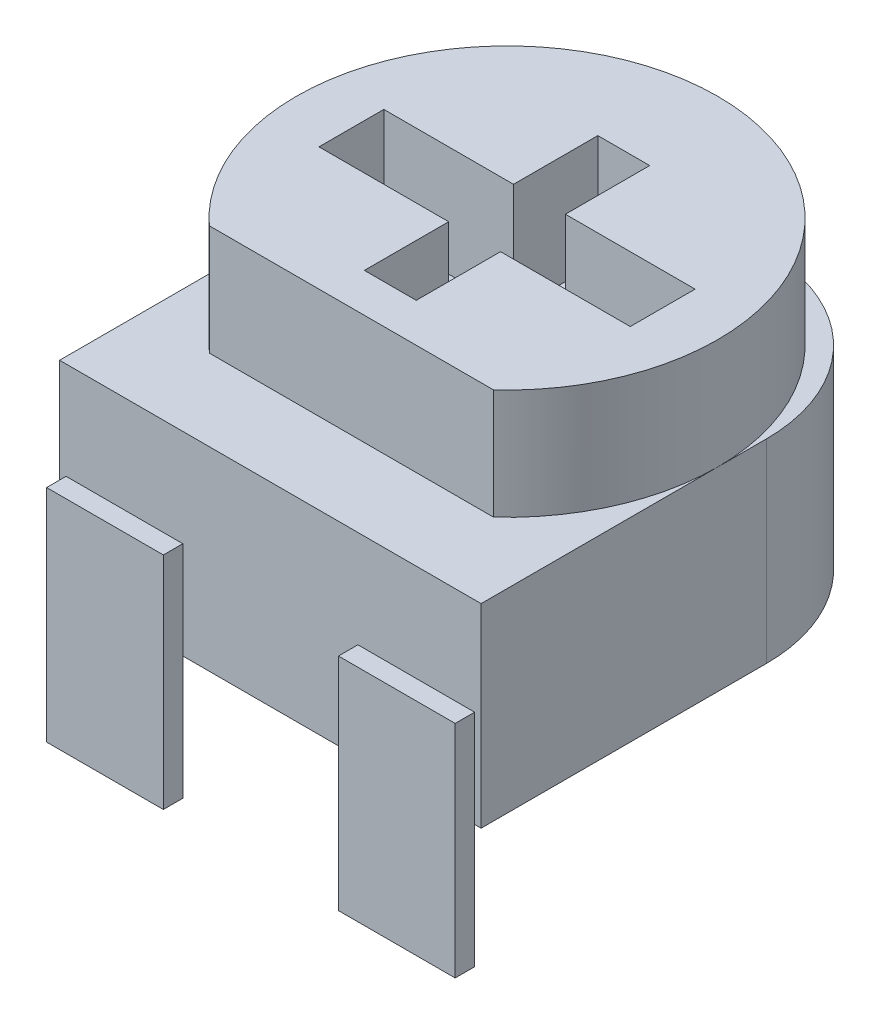
ISO-10303-21;
HEADER;
FILE_DESCRIPTION(('STEP AP214'),'2;1');
FILE_NAME('part.step','',(''),(''),'','','');
FILE_SCHEMA(('AUTOMOTIVE_DESIGN { 1 0 10303 214 1 1 1 1 }'));
ENDSEC;
DATA;
#1=APPLICATION_CONTEXT('core data for automotive mechanical design processes');
#2=APPLICATION_PROTOCOL_DEFINITION('international standard','automotive_design',2000,#1);
#3=PRODUCT_CONTEXT('',#1,'mechanical');
#4=PRODUCT('Part','Part','',(#3));
#5=PRODUCT_RELATED_PRODUCT_CATEGORY('part','',(#4));
#6=PRODUCT_DEFINITION_FORMATION('','',#4);
#7=PRODUCT_DEFINITION_CONTEXT('part definition',#1,'design');
#8=PRODUCT_DEFINITION('design','',#6,#7);
#9=PRODUCT_DEFINITION_SHAPE('','',#8);
#10=(LENGTH_UNIT() NAMED_UNIT(*) SI_UNIT(.MILLI.,.METRE.));
#11=(NAMED_UNIT(*) PLANE_ANGLE_UNIT() SI_UNIT($,.RADIAN.));
#12=(NAMED_UNIT(*) SI_UNIT($,.STERADIAN.) SOLID_ANGLE_UNIT());
#13=UNCERTAINTY_MEASURE_WITH_UNIT(LENGTH_MEASURE(1.E-05),#10,'distance_accuracy_value','');
#14=(GEOMETRIC_REPRESENTATION_CONTEXT(3) GLOBAL_UNCERTAINTY_ASSIGNED_CONTEXT((#13)) GLOBAL_UNIT_ASSIGNED_CONTEXT((#10,
#11,#12)) REPRESENTATION_CONTEXT('',''));
#15=CARTESIAN_POINT('',(0.,0.,0.));
#16=DIRECTION('',(0.,0.,1.));
#17=DIRECTION('',(1.,0.,0.));
#18=AXIS2_PLACEMENT_3D('',#15,#16,#17);
#19=CARTESIAN_POINT('',(0.,0.,0.));
#20=DIRECTION('',(0.,-1.,0.));
#21=DIRECTION('',(0.,0.,-1.));
#22=AXIS2_PLACEMENT_3D('',#19,#20,#21);
#23=PLANE('',#22);
#24=DIRECTION('',(1.,0.,0.));
#25=VECTOR('',#24,1.);
#26=CARTESIAN_POINT('',(-3.25,0.,-3.25));
#27=LINE('',#26,#25);
#28=CARTESIAN_POINT('',(-0.750000000000001,0.,-3.25));
#29=VERTEX_POINT('',#28);
#30=CARTESIAN_POINT('',(0.749999999999998,0.,-3.25));
#31=VERTEX_POINT('',#30);
#32=EDGE_CURVE('E587',#29,#31,#27,.T.);
#33=ORIENTED_EDGE('',*,*,#32,.T.);
#34=CARTESIAN_POINT('',(0.75,0.,-0.75));
#35=DIRECTION('',(0.,-1.,0.));
#36=DIRECTION('',(0.,0.,-1.));
#37=AXIS2_PLACEMENT_3D('',#34,#35,#36);
#38=CIRCLE('',#37,2.5);
#39=CARTESIAN_POINT('',(3.25,0.,-0.750000000000001));
#40=VERTEX_POINT('',#39);
#41=EDGE_CURVE('E638',#31,#40,#38,.T.);
#42=ORIENTED_EDGE('',*,*,#41,.T.);
#43=DIRECTION('',(0.,0.,1.));
#44=VECTOR('',#43,1.);
#45=CARTESIAN_POINT('',(3.25,0.,-3.25));
#46=LINE('',#45,#44);
#47=CARTESIAN_POINT('',(3.25,0.,3.65));
#48=VERTEX_POINT('',#47);
#49=EDGE_CURVE('E608',#40,#48,#46,.T.);
#50=ORIENTED_EDGE('',*,*,#49,.T.);
#51=DIRECTION('',(1.,0.,0.));
#52=VECTOR('',#51,1.);
#53=CARTESIAN_POINT('',(-3.25,0.,3.65));
#54=LINE('',#53,#52);
#55=CARTESIAN_POINT('',(3.15,0.,3.65));
#56=VERTEX_POINT('',#55);
#57=EDGE_CURVE('E612',#56,#48,#54,.T.);
#58=ORIENTED_EDGE('',*,*,#57,.F.);
#59=CARTESIAN_POINT('',(1.35,0.,3.65));
#60=VERTEX_POINT('',#59);
#61=EDGE_CURVE('E679',#60,#56,#54,.T.);
#62=ORIENTED_EDGE('',*,*,#61,.F.);
#63=CARTESIAN_POINT('',(-1.35,0.,3.65));
#64=VERTEX_POINT('',#63);
#65=EDGE_CURVE('E676',#64,#60,#54,.T.);
#66=ORIENTED_EDGE('',*,*,#65,.F.);
#67=CARTESIAN_POINT('',(-3.15,0.,3.65));
#68=VERTEX_POINT('',#67);
#69=EDGE_CURVE('E617',#68,#64,#54,.T.);
#70=ORIENTED_EDGE('',*,*,#69,.F.);
#71=CARTESIAN_POINT('',(-3.25,0.,3.65));
#72=VERTEX_POINT('',#71);
#73=EDGE_CURVE('E613',#72,#68,#54,.T.);
#74=ORIENTED_EDGE('',*,*,#73,.F.);
#75=DIRECTION('',(0.,0.,1.));
#76=VECTOR('',#75,1.);
#77=CARTESIAN_POINT('',(-3.25,0.,-3.25));
#78=LINE('',#77,#76);
#79=CARTESIAN_POINT('',(-3.25,0.,-0.75));
#80=VERTEX_POINT('',#79);
#81=EDGE_CURVE('E616',#80,#72,#78,.T.);
#82=ORIENTED_EDGE('',*,*,#81,.F.);
#83=CARTESIAN_POINT('',(-0.749999999999999,0.,-0.75));
#84=DIRECTION('',(0.,-1.,0.));
#85=DIRECTION('',(0.,0.,-1.));
#86=AXIS2_PLACEMENT_3D('',#83,#84,#85);
#87=CIRCLE('',#86,2.5);
#88=EDGE_CURVE('E635',#80,#29,#87,.T.);
#89=ORIENTED_EDGE('',*,*,#88,.T.);
#90=EDGE_LOOP('',(#33,#42,#50,#58,#62,#66,#70,#74,#82,#89));
#91=FACE_BOUND('',#90,.T.);
#92=DIRECTION('',(1.,0.,0.));
#93=VECTOR('',#92,1.);
#94=CARTESIAN_POINT('',(-1.15,0.,-2.55));
#95=LINE('',#94,#93);
#96=CARTESIAN_POINT('',(-1.15,0.,-2.55));
#97=VERTEX_POINT('',#96);
#98=CARTESIAN_POINT('',(1.15,0.,-2.55));
#99=VERTEX_POINT('',#98);
#100=EDGE_CURVE('E109',#97,#99,#95,.T.);
#101=ORIENTED_EDGE('',*,*,#100,.F.);
#102=DIRECTION('',(0.,0.,-1.));
#103=VECTOR('',#102,1.);
#104=CARTESIAN_POINT('',(-1.15,0.,-2.25));
#105=LINE('',#104,#103);
#106=CARTESIAN_POINT('',(-1.15,0.,-2.25));
#107=VERTEX_POINT('',#106);
#108=EDGE_CURVE('E320',#107,#97,#105,.T.);
#109=ORIENTED_EDGE('',*,*,#108,.F.);
#110=DIRECTION('',(1.,0.,0.));
#111=VECTOR('',#110,1.);
#112=CARTESIAN_POINT('',(-1.15,0.,-2.25));
#113=LINE('',#112,#111);
#114=CARTESIAN_POINT('',(1.15,0.,-2.25));
#115=VERTEX_POINT('',#114);
#116=EDGE_CURVE('E323',#107,#115,#113,.T.);
#117=ORIENTED_EDGE('',*,*,#116,.T.);
#118=DIRECTION('',(0.,0.,-1.));
#119=VECTOR('',#118,1.);
#120=CARTESIAN_POINT('',(1.15,0.,-2.25));
#121=LINE('',#120,#119);
#122=EDGE_CURVE('E114',#115,#99,#121,.T.);
#123=ORIENTED_EDGE('',*,*,#122,.T.);
#124=EDGE_LOOP('',(#101,#109,#117,#123));
#125=FACE_BOUND('',#124,.T.);
#126=ADVANCED_FACE('F93',(#91,#125),#23,.T.);
#127=CARTESIAN_POINT('',(-3.25,3.,3.65));
#128=DIRECTION('',(0.,0.,-1.));
#129=DIRECTION('',(-1.,0.,0.));
#130=AXIS2_PLACEMENT_3D('',#127,#128,#129);
#131=PLANE('',#130);
#132=DIRECTION('',(0.,-1.,0.));
#133=VECTOR('',#132,1.);
#134=CARTESIAN_POINT('',(1.35,1.5,3.65));
#135=LINE('',#134,#133);
#136=CARTESIAN_POINT('',(1.35,1.5,3.65));
#137=VERTEX_POINT('',#136);
#138=EDGE_CURVE('E376',#137,#60,#135,.T.);
#139=ORIENTED_EDGE('',*,*,#138,.F.);
#140=DIRECTION('',(1.,0.,0.));
#141=VECTOR('',#140,1.);
#142=CARTESIAN_POINT('',(1.35,1.5,3.65));
#143=LINE('',#142,#141);
#144=CARTESIAN_POINT('',(3.15,1.5,3.65));
#145=VERTEX_POINT('',#144);
#146=EDGE_CURVE('E390',#137,#145,#143,.T.);
#147=ORIENTED_EDGE('',*,*,#146,.T.);
#148=DIRECTION('',(0.,-1.,0.));
#149=VECTOR('',#148,1.);
#150=CARTESIAN_POINT('',(3.15,1.5,3.65));
#151=LINE('',#150,#149);
#152=EDGE_CURVE('E386',#145,#56,#151,.T.);
#153=ORIENTED_EDGE('',*,*,#152,.T.);
#154=ORIENTED_EDGE('',*,*,#57,.T.);
#155=DIRECTION('',(0.,-1.,0.));
#156=VECTOR('',#155,1.);
#157=CARTESIAN_POINT('',(3.25,3.,3.65));
#158=LINE('',#157,#156);
#159=CARTESIAN_POINT('',(3.25,3.,3.65));
#160=VERTEX_POINT('',#159);
#161=EDGE_CURVE('E604',#160,#48,#158,.T.);
#162=ORIENTED_EDGE('',*,*,#161,.F.);
#163=DIRECTION('',(1.,0.,0.));
#164=VECTOR('',#163,1.);
#165=CARTESIAN_POINT('',(-3.25,3.,3.65));
#166=LINE('',#165,#164);
#167=CARTESIAN_POINT('',(-3.25,3.,3.65));
#168=VERTEX_POINT('',#167);
#169=EDGE_CURVE('E596',#168,#160,#166,.T.);
#170=ORIENTED_EDGE('',*,*,#169,.F.);
#171=DIRECTION('',(0.,-1.,0.));
#172=VECTOR('',#171,1.);
#173=CARTESIAN_POINT('',(-3.25,3.,3.65));
#174=LINE('',#173,#172);
#175=EDGE_CURVE('E620',#168,#72,#174,.T.);
#176=ORIENTED_EDGE('',*,*,#175,.T.);
#177=ORIENTED_EDGE('',*,*,#73,.T.);
#178=DIRECTION('',(0.,-1.,0.));
#179=VECTOR('',#178,1.);
#180=CARTESIAN_POINT('',(-3.15,1.5,3.65));
#181=LINE('',#180,#179);
#182=CARTESIAN_POINT('',(-3.15,1.5,3.65));
#183=VERTEX_POINT('',#182);
#184=EDGE_CURVE('E412',#183,#68,#181,.T.);
#185=ORIENTED_EDGE('',*,*,#184,.F.);
#186=DIRECTION('',(1.,0.,0.));
#187=VECTOR('',#186,1.);
#188=CARTESIAN_POINT('',(-3.15,1.5,3.65));
#189=LINE('',#188,#187);
#190=CARTESIAN_POINT('',(-1.35,1.5,3.65));
#191=VERTEX_POINT('',#190);
#192=EDGE_CURVE('E393',#183,#191,#189,.T.);
#193=ORIENTED_EDGE('',*,*,#192,.T.);
#194=DIRECTION('',(0.,-1.,0.));
#195=VECTOR('',#194,1.);
#196=CARTESIAN_POINT('',(-1.35,1.5,3.65));
#197=LINE('',#196,#195);
#198=EDGE_CURVE('E426',#191,#64,#197,.T.);
#199=ORIENTED_EDGE('',*,*,#198,.T.);
#200=ORIENTED_EDGE('',*,*,#65,.T.);
#201=EDGE_LOOP('',(#139,#147,#153,#154,#162,#170,#176,#177,#185,#193,#199,#200));
#202=FACE_BOUND('',#201,.T.);
#203=ADVANCED_FACE('F665',(#202),#131,.F.);
#204=CARTESIAN_POINT('',(0.,4.7,0.));
#205=DIRECTION('',(0.,-1.,0.));
#206=DIRECTION('',(0.,0.,-1.));
#207=AXIS2_PLACEMENT_3D('',#204,#205,#206);
#208=PLANE('',#207);
#209=DIRECTION('',(1.,0.,0.));
#210=VECTOR('',#209,1.);
#211=CARTESIAN_POINT('',(0.,4.7,1.8));
#212=LINE('',#211,#210);
#213=CARTESIAN_POINT('',(-0.4,4.7,1.8));
#214=VERTEX_POINT('',#213);
#215=CARTESIAN_POINT('',(0.4,4.7,1.8));
#216=VERTEX_POINT('',#215);
#217=EDGE_CURVE('E476',#214,#216,#212,.T.);
#218=ORIENTED_EDGE('',*,*,#217,.F.);
#219=DIRECTION('',(0.,0.,-1.));
#220=VECTOR('',#219,1.);
#221=CARTESIAN_POINT('',(-0.4,4.7,0.));
#222=LINE('',#221,#220);
#223=CARTESIAN_POINT('',(-0.4,4.7,0.5));
#224=VERTEX_POINT('',#223);
#225=EDGE_CURVE('E480',#214,#224,#222,.T.);
#226=ORIENTED_EDGE('',*,*,#225,.T.);
#227=DIRECTION('',(1.,0.,0.));
#228=VECTOR('',#227,1.);
#229=CARTESIAN_POINT('',(0.,4.7,0.5));
#230=LINE('',#229,#228);
#231=CARTESIAN_POINT('',(-2.4,4.7,0.5));
#232=VERTEX_POINT('',#231);
#233=EDGE_CURVE('E536',#232,#224,#230,.T.);
#234=ORIENTED_EDGE('',*,*,#233,.F.);
#235=DIRECTION('',(0.,0.,-1.));
#236=VECTOR('',#235,1.);
#237=CARTESIAN_POINT('',(-2.4,4.7,0.));
#238=LINE('',#237,#236);
#239=CARTESIAN_POINT('',(-2.4,4.7,-0.5));
#240=VERTEX_POINT('',#239);
#241=EDGE_CURVE('E531',#232,#240,#238,.T.);
#242=ORIENTED_EDGE('',*,*,#241,.T.);
#243=DIRECTION('',(1.,0.,0.));
#244=VECTOR('',#243,1.);
#245=CARTESIAN_POINT('',(0.,4.7,-0.5));
#246=LINE('',#245,#244);
#247=CARTESIAN_POINT('',(-0.4,4.7,-0.5));
#248=VERTEX_POINT('',#247);
#249=EDGE_CURVE('E527',#240,#248,#246,.T.);
#250=ORIENTED_EDGE('',*,*,#249,.T.);
#251=CARTESIAN_POINT('',(-0.4,4.7,-1.8));
#252=VERTEX_POINT('',#251);
#253=EDGE_CURVE('E479',#248,#252,#222,.T.);
#254=ORIENTED_EDGE('',*,*,#253,.T.);
#255=DIRECTION('',(1.,0.,0.));
#256=VECTOR('',#255,1.);
#257=CARTESIAN_POINT('',(0.,4.7,-1.8));
#258=LINE('',#257,#256);
#259=CARTESIAN_POINT('',(0.4,4.7,-1.8));
#260=VERTEX_POINT('',#259);
#261=EDGE_CURVE('E467',#252,#260,#258,.T.);
#262=ORIENTED_EDGE('',*,*,#261,.T.);
#263=DIRECTION('',(0.,0.,-1.));
#264=VECTOR('',#263,1.);
#265=CARTESIAN_POINT('',(0.4,4.7,0.));
#266=LINE('',#265,#264);
#267=CARTESIAN_POINT('',(0.4,4.7,-0.5));
#268=VERTEX_POINT('',#267);
#269=EDGE_CURVE('E471',#268,#260,#266,.T.);
#270=ORIENTED_EDGE('',*,*,#269,.F.);
#271=CARTESIAN_POINT('',(2.4,4.7,-0.5));
#272=VERTEX_POINT('',#271);
#273=EDGE_CURVE('E525',#268,#272,#246,.T.);
#274=ORIENTED_EDGE('',*,*,#273,.T.);
#275=DIRECTION('',(0.,0.,-1.));
#276=VECTOR('',#275,1.);
#277=CARTESIAN_POINT('',(2.4,4.7,0.));
#278=LINE('',#277,#276);
#279=CARTESIAN_POINT('',(2.4,4.7,0.5));
#280=VERTEX_POINT('',#279);
#281=EDGE_CURVE('E521',#280,#272,#278,.T.);
#282=ORIENTED_EDGE('',*,*,#281,.F.);
#283=CARTESIAN_POINT('',(0.4,4.7,0.5));
#284=VERTEX_POINT('',#283);
#285=EDGE_CURVE('E535',#284,#280,#230,.T.);
#286=ORIENTED_EDGE('',*,*,#285,.F.);
#287=EDGE_CURVE('E473',#216,#284,#266,.T.);
#288=ORIENTED_EDGE('',*,*,#287,.F.);
#289=EDGE_LOOP('',(#218,#226,#234,#242,#250,#254,#262,#270,#274,#282,#286,#288));
#290=FACE_BOUND('',#289,.T.);
#291=DIRECTION('',(1.,0.,0.));
#292=VECTOR('',#291,1.);
#293=CARTESIAN_POINT('',(0.,4.7,2.4));
#294=LINE('',#293,#292);
#295=CARTESIAN_POINT('',(-2.19146070008111,4.7,2.4));
#296=VERTEX_POINT('',#295);
#297=CARTESIAN_POINT('',(2.19146070008111,4.7,2.4));
#298=VERTEX_POINT('',#297);
#299=EDGE_CURVE('E453',#296,#298,#294,.T.);
#300=ORIENTED_EDGE('',*,*,#299,.T.);
#301=CARTESIAN_POINT('',(0.,4.7,0.));
#302=DIRECTION('',(0.,-1.,0.));
#303=DIRECTION('',(0.,0.,-1.));
#304=AXIS2_PLACEMENT_3D('',#301,#302,#303);
#305=CIRCLE('',#304,3.25);
#306=EDGE_CURVE('E571',#296,#298,#305,.T.);
#307=ORIENTED_EDGE('',*,*,#306,.F.);
#308=EDGE_LOOP('',(#300,#307));
#309=FACE_BOUND('',#308,.T.);
#310=ADVANCED_FACE('F727',(#290,#309),#208,.F.);
#311=CARTESIAN_POINT('',(0.,4.7,0.));
#312=DIRECTION('',(0.,-1.,0.));
#313=DIRECTION('',(0.,0.,-1.));
#314=AXIS2_PLACEMENT_3D('',#311,#312,#313);
#315=CYLINDRICAL_SURFACE('',#314,3.25);
#316=CARTESIAN_POINT('',(0.,3.,0.));
#317=DIRECTION('',(0.,-1.,0.));
#318=DIRECTION('',(0.,0.,-1.));
#319=AXIS2_PLACEMENT_3D('',#316,#317,#318);
#320=CIRCLE('',#319,3.25);
#321=CARTESIAN_POINT('',(-2.19146070008111,3.,2.4));
#322=VERTEX_POINT('',#321);
#323=CARTESIAN_POINT('',(-3.25,3.,0.));
#324=VERTEX_POINT('',#323);
#325=EDGE_CURVE('E579',#322,#324,#320,.T.);
#326=ORIENTED_EDGE('',*,*,#325,.F.);
#327=DIRECTION('',(0.,1.,0.));
#328=VECTOR('',#327,1.);
#329=CARTESIAN_POINT('',(-2.19146070008111,-1.4645828472546,2.4));
#330=LINE('',#329,#328);
#331=EDGE_CURVE('E458',#322,#296,#330,.T.);
#332=ORIENTED_EDGE('',*,*,#331,.T.);
#333=ORIENTED_EDGE('',*,*,#306,.T.);
#334=DIRECTION('',(0.,1.,0.));
#335=VECTOR('',#334,1.);
#336=CARTESIAN_POINT('',(2.19146070008111,-1.4645828472546,2.4));
#337=LINE('',#336,#335);
#338=CARTESIAN_POINT('',(2.19146070008111,3.,2.4));
#339=VERTEX_POINT('',#338);
#340=EDGE_CURVE('E441',#339,#298,#337,.T.);
#341=ORIENTED_EDGE('',*,*,#340,.F.);
#342=CARTESIAN_POINT('',(3.25,3.,0.));
#343=VERTEX_POINT('',#342);
#344=EDGE_CURVE('E631',#343,#339,#320,.T.);
#345=ORIENTED_EDGE('',*,*,#344,.F.);
#346=CARTESIAN_POINT('',(0.,3.,-3.25));
#347=VERTEX_POINT('',#346);
#348=EDGE_CURVE('E570',#347,#343,#320,.T.);
#349=ORIENTED_EDGE('',*,*,#348,.F.);
#350=EDGE_CURVE('E580',#324,#347,#320,.T.);
#351=ORIENTED_EDGE('',*,*,#350,.F.);
#352=EDGE_LOOP('',(#326,#332,#333,#341,#345,#349,#351));
#353=FACE_BOUND('',#352,.T.);
#354=ADVANCED_FACE('F771',(#353),#315,.T.);
#355=CARTESIAN_POINT('',(0.,3.,0.));
#356=DIRECTION('',(0.,-1.,0.));
#357=DIRECTION('',(0.,0.,-1.));
#358=AXIS2_PLACEMENT_3D('',#355,#356,#357);
#359=PLANE('',#358);
#360=DIRECTION('',(0.,0.,1.));
#361=VECTOR('',#360,1.);
#362=CARTESIAN_POINT('',(3.25,3.,-3.25));
#363=LINE('',#362,#361);
#364=CARTESIAN_POINT('',(3.25,3.,-0.750000000000001));
#365=VERTEX_POINT('',#364);
#366=EDGE_CURVE('E593',#365,#343,#363,.T.);
#367=ORIENTED_EDGE('',*,*,#366,.F.);
#368=CARTESIAN_POINT('',(0.75,3.,-0.75));
#369=DIRECTION('',(0.,-1.,0.));
#370=DIRECTION('',(0.,0.,-1.));
#371=AXIS2_PLACEMENT_3D('',#368,#369,#370);
#372=CIRCLE('',#371,2.5);
#373=CARTESIAN_POINT('',(0.749999999999998,3.,-3.25));
#374=VERTEX_POINT('',#373);
#375=EDGE_CURVE('E644',#365,#374,#372,.F.);
#376=ORIENTED_EDGE('',*,*,#375,.T.);
#377=DIRECTION('',(1.,0.,0.));
#378=VECTOR('',#377,1.);
#379=CARTESIAN_POINT('',(-3.25,3.,-3.25));
#380=LINE('',#379,#378);
#381=EDGE_CURVE('E592',#347,#374,#380,.T.);
#382=ORIENTED_EDGE('',*,*,#381,.F.);
#383=ORIENTED_EDGE('',*,*,#348,.T.);
#384=EDGE_LOOP('',(#367,#376,#382,#383));
#385=FACE_BOUND('',#384,.T.);
#386=ADVANCED_FACE('F761',(#385),#359,.F.);
#387=EDGE_CURVE('E591',#343,#160,#363,.T.);
#388=ORIENTED_EDGE('',*,*,#387,.F.);
#389=ORIENTED_EDGE('',*,*,#344,.T.);
#390=DIRECTION('',(1.,0.,0.));
#391=VECTOR('',#390,1.);
#392=CARTESIAN_POINT('',(0.,3.,2.4));
#393=LINE('',#392,#391);
#394=EDGE_CURVE('E457',#322,#339,#393,.T.);
#395=ORIENTED_EDGE('',*,*,#394,.F.);
#396=ORIENTED_EDGE('',*,*,#325,.T.);
#397=DIRECTION('',(0.,0.,1.));
#398=VECTOR('',#397,1.);
#399=CARTESIAN_POINT('',(-3.25,3.,-3.25));
#400=LINE('',#399,#398);
#401=EDGE_CURVE('E600',#324,#168,#400,.T.);
#402=ORIENTED_EDGE('',*,*,#401,.T.);
#403=ORIENTED_EDGE('',*,*,#169,.T.);
#404=EDGE_LOOP('',(#388,#389,#395,#396,#402,#403));
#405=FACE_BOUND('',#404,.T.);
#406=ADVANCED_FACE('F741',(#405),#359,.F.);
#407=CARTESIAN_POINT('',(-3.25,3.,-3.25));
#408=DIRECTION('',(0.,0.,-1.));
#409=DIRECTION('',(-1.,0.,0.));
#410=AXIS2_PLACEMENT_3D('',#407,#408,#409);
#411=PLANE('',#410);
#412=ORIENTED_EDGE('',*,*,#381,.T.);
#413=DIRECTION('',(0.,-1.,0.));
#414=VECTOR('',#413,1.);
#415=CARTESIAN_POINT('',(0.749999999999999,3.,-3.25));
#416=LINE('',#415,#414);
#417=EDGE_CURVE('E630',#374,#31,#416,.T.);
#418=ORIENTED_EDGE('',*,*,#417,.T.);
#419=ORIENTED_EDGE('',*,*,#32,.F.);
#420=DIRECTION('',(0.,-1.,0.));
#421=VECTOR('',#420,1.);
#422=CARTESIAN_POINT('',(-0.75,3.,-3.25));
#423=LINE('',#422,#421);
#424=CARTESIAN_POINT('',(-0.750000000000001,3.,-3.25));
#425=VERTEX_POINT('',#424);
#426=EDGE_CURVE('E627',#29,#425,#423,.F.);
#427=ORIENTED_EDGE('',*,*,#426,.T.);
#428=EDGE_CURVE('E588',#425,#347,#380,.T.);
#429=ORIENTED_EDGE('',*,*,#428,.T.);
#430=EDGE_LOOP('',(#412,#418,#419,#427,#429));
#431=FACE_BOUND('',#430,.T.);
#432=ADVANCED_FACE('F735',(#431),#411,.T.);
#433=CARTESIAN_POINT('',(-3.25,3.,-3.25));
#434=DIRECTION('',(1.,0.,0.));
#435=DIRECTION('',(0.,0.,-1.));
#436=AXIS2_PLACEMENT_3D('',#433,#434,#435);
#437=PLANE('',#436);
#438=CARTESIAN_POINT('',(-3.25,3.,-0.75));
#439=VERTEX_POINT('',#438);
#440=EDGE_CURVE('E601',#439,#324,#400,.T.);
#441=ORIENTED_EDGE('',*,*,#440,.F.);
#442=DIRECTION('',(0.,-1.,0.));
#443=VECTOR('',#442,1.);
#444=CARTESIAN_POINT('',(-3.25,0.,-0.75));
#445=LINE('',#444,#443);
#446=EDGE_CURVE('E102',#439,#80,#445,.T.);
#447=ORIENTED_EDGE('',*,*,#446,.T.);
#448=ORIENTED_EDGE('',*,*,#81,.T.);
#449=ORIENTED_EDGE('',*,*,#175,.F.);
#450=ORIENTED_EDGE('',*,*,#401,.F.);
#451=EDGE_LOOP('',(#441,#447,#448,#449,#450));
#452=FACE_BOUND('',#451,.T.);
#453=ADVANCED_FACE('F652',(#452),#437,.F.);
#454=CARTESIAN_POINT('',(3.25,3.,-3.25));
#455=DIRECTION('',(1.,0.,0.));
#456=DIRECTION('',(0.,0.,-1.));
#457=AXIS2_PLACEMENT_3D('',#454,#455,#456);
#458=PLANE('',#457);
#459=ORIENTED_EDGE('',*,*,#49,.F.);
#460=DIRECTION('',(0.,-1.,0.));
#461=VECTOR('',#460,1.);
#462=CARTESIAN_POINT('',(3.25,3.,-0.750000000000001));
#463=LINE('',#462,#461);
#464=EDGE_CURVE('E641',#40,#365,#463,.F.);
#465=ORIENTED_EDGE('',*,*,#464,.T.);
#466=ORIENTED_EDGE('',*,*,#366,.T.);
#467=ORIENTED_EDGE('',*,*,#387,.T.);
#468=ORIENTED_EDGE('',*,*,#161,.T.);
#469=EDGE_LOOP('',(#459,#465,#466,#467,#468));
#470=FACE_BOUND('',#469,.T.);
#471=ADVANCED_FACE('F734',(#470),#458,.T.);
#472=ORIENTED_EDGE('',*,*,#428,.F.);
#473=CARTESIAN_POINT('',(-0.749999999999999,3.,-0.75));
#474=DIRECTION('',(0.,-1.,0.));
#475=DIRECTION('',(0.,0.,-1.));
#476=AXIS2_PLACEMENT_3D('',#473,#474,#475);
#477=CIRCLE('',#476,2.5);
#478=EDGE_CURVE('E12',#425,#439,#477,.F.);
#479=ORIENTED_EDGE('',*,*,#478,.T.);
#480=ORIENTED_EDGE('',*,*,#440,.T.);
#481=ORIENTED_EDGE('',*,*,#350,.T.);
#482=EDGE_LOOP('',(#472,#479,#480,#481));
#483=FACE_BOUND('',#482,.T.);
#484=ADVANCED_FACE('F731',(#483),#359,.F.);
#485=CARTESIAN_POINT('',(0.,4.7,-0.5));
#486=DIRECTION('',(0.,0.,-1.));
#487=DIRECTION('',(-1.,0.,0.));
#488=AXIS2_PLACEMENT_3D('',#485,#486,#487);
#489=PLANE('',#488);
#490=DIRECTION('',(0.,1.,0.));
#491=VECTOR('',#490,1.);
#492=CARTESIAN_POINT('',(0.4,4.7,-0.5));
#493=LINE('',#492,#491);
#494=CARTESIAN_POINT('',(0.4,3.,-0.5));
#495=VERTEX_POINT('',#494);
#496=EDGE_CURVE('E505',#495,#268,#493,.T.);
#497=ORIENTED_EDGE('',*,*,#496,.F.);
#498=DIRECTION('',(1.,0.,0.));
#499=VECTOR('',#498,1.);
#500=CARTESIAN_POINT('',(0.,3.,-0.5));
#501=LINE('',#500,#499);
#502=CARTESIAN_POINT('',(2.4,3.,-0.5));
#503=VERTEX_POINT('',#502);
#504=EDGE_CURVE('E544',#495,#503,#501,.T.);
#505=ORIENTED_EDGE('',*,*,#504,.T.);
#506=DIRECTION('',(0.,-1.,0.));
#507=VECTOR('',#506,1.);
#508=CARTESIAN_POINT('',(2.4,4.7,-0.5));
#509=LINE('',#508,#507);
#510=EDGE_CURVE('E566',#272,#503,#509,.T.);
#511=ORIENTED_EDGE('',*,*,#510,.F.);
#512=ORIENTED_EDGE('',*,*,#273,.F.);
#513=EDGE_LOOP('',(#497,#505,#511,#512));
#514=FACE_BOUND('',#513,.T.);
#515=ADVANCED_FACE('F871',(#514),#489,.F.);
#516=CARTESIAN_POINT('',(0.,4.7,0.5));
#517=DIRECTION('',(0.,0.,-1.));
#518=DIRECTION('',(-1.,0.,0.));
#519=AXIS2_PLACEMENT_3D('',#516,#517,#518);
#520=PLANE('',#519);
#521=DIRECTION('',(1.,0.,0.));
#522=VECTOR('',#521,1.);
#523=CARTESIAN_POINT('',(0.,3.,0.5));
#524=LINE('',#523,#522);
#525=CARTESIAN_POINT('',(0.4,3.,0.5));
#526=VERTEX_POINT('',#525);
#527=CARTESIAN_POINT('',(2.4,3.,0.5));
#528=VERTEX_POINT('',#527);
#529=EDGE_CURVE('E553',#526,#528,#524,.T.);
#530=ORIENTED_EDGE('',*,*,#529,.F.);
#531=DIRECTION('',(0.,1.,0.));
#532=VECTOR('',#531,1.);
#533=CARTESIAN_POINT('',(0.4,4.7,0.5));
#534=LINE('',#533,#532);
#535=EDGE_CURVE('E575',#526,#284,#534,.T.);
#536=ORIENTED_EDGE('',*,*,#535,.T.);
#537=ORIENTED_EDGE('',*,*,#285,.T.);
#538=DIRECTION('',(0.,-1.,0.));
#539=VECTOR('',#538,1.);
#540=CARTESIAN_POINT('',(2.4,4.7,0.5));
#541=LINE('',#540,#539);
#542=EDGE_CURVE('E540',#280,#528,#541,.T.);
#543=ORIENTED_EDGE('',*,*,#542,.T.);
#544=EDGE_LOOP('',(#530,#536,#537,#543));
#545=FACE_BOUND('',#544,.T.);
#546=ADVANCED_FACE('F862',(#545),#520,.T.);
#547=CARTESIAN_POINT('',(2.4,4.7,0.));
#548=DIRECTION('',(-1.,0.,0.));
#549=DIRECTION('',(0.,0.,1.));
#550=AXIS2_PLACEMENT_3D('',#547,#548,#549);
#551=PLANE('',#550);
#552=DIRECTION('',(0.,0.,-1.));
#553=VECTOR('',#552,1.);
#554=CARTESIAN_POINT('',(2.4,3.,0.));
#555=LINE('',#554,#553);
#556=EDGE_CURVE('E520',#528,#503,#555,.T.);
#557=ORIENTED_EDGE('',*,*,#556,.F.);
#558=ORIENTED_EDGE('',*,*,#542,.F.);
#559=ORIENTED_EDGE('',*,*,#281,.T.);
#560=ORIENTED_EDGE('',*,*,#510,.T.);
#561=EDGE_LOOP('',(#557,#558,#559,#560));
#562=FACE_BOUND('',#561,.T.);
#563=ADVANCED_FACE('F869',(#562),#551,.T.);
#564=CARTESIAN_POINT('',(-2.4,3.,-0.5));
#565=VERTEX_POINT('',#564);
#566=CARTESIAN_POINT('',(-0.4,3.,-0.5));
#567=VERTEX_POINT('',#566);
#568=EDGE_CURVE('E545',#565,#567,#501,.T.);
#569=ORIENTED_EDGE('',*,*,#568,.T.);
#570=DIRECTION('',(0.,1.,0.));
#571=VECTOR('',#570,1.);
#572=CARTESIAN_POINT('',(-0.4,4.7,-0.5));
#573=LINE('',#572,#571);
#574=EDGE_CURVE('E516',#567,#248,#573,.T.);
#575=ORIENTED_EDGE('',*,*,#574,.T.);
#576=ORIENTED_EDGE('',*,*,#249,.F.);
#577=DIRECTION('',(0.,-1.,0.));
#578=VECTOR('',#577,1.);
#579=CARTESIAN_POINT('',(-2.4,4.7,-0.5));
#580=LINE('',#579,#578);
#581=EDGE_CURVE('E563',#240,#565,#580,.T.);
#582=ORIENTED_EDGE('',*,*,#581,.T.);
#583=EDGE_LOOP('',(#569,#575,#576,#582));
#584=FACE_BOUND('',#583,.T.);
#585=ADVANCED_FACE('F865',(#584),#489,.F.);
#586=CARTESIAN_POINT('',(-2.4,4.7,0.));
#587=DIRECTION('',(-1.,0.,0.));
#588=DIRECTION('',(0.,0.,1.));
#589=AXIS2_PLACEMENT_3D('',#586,#587,#588);
#590=PLANE('',#589);
#591=DIRECTION('',(0.,0.,-1.));
#592=VECTOR('',#591,1.);
#593=CARTESIAN_POINT('',(-2.4,3.,0.));
#594=LINE('',#593,#592);
#595=CARTESIAN_POINT('',(-2.4,3.,0.5));
#596=VERTEX_POINT('',#595);
#597=EDGE_CURVE('E549',#596,#565,#594,.T.);
#598=ORIENTED_EDGE('',*,*,#597,.T.);
#599=ORIENTED_EDGE('',*,*,#581,.F.);
#600=ORIENTED_EDGE('',*,*,#241,.F.);
#601=DIRECTION('',(0.,-1.,0.));
#602=VECTOR('',#601,1.);
#603=CARTESIAN_POINT('',(-2.4,4.7,0.5));
#604=LINE('',#603,#602);
#605=EDGE_CURVE('E560',#232,#596,#604,.T.);
#606=ORIENTED_EDGE('',*,*,#605,.T.);
#607=EDGE_LOOP('',(#598,#599,#600,#606));
#608=FACE_BOUND('',#607,.T.);
#609=ADVANCED_FACE('F860',(#608),#590,.F.);
#610=DIRECTION('',(0.,1.,0.));
#611=VECTOR('',#610,1.);
#612=CARTESIAN_POINT('',(-0.4,4.7,0.5));
#613=LINE('',#612,#611);
#614=CARTESIAN_POINT('',(-0.4,3.,0.5));
#615=VERTEX_POINT('',#614);
#616=EDGE_CURVE('E584',#615,#224,#613,.T.);
#617=ORIENTED_EDGE('',*,*,#616,.F.);
#618=EDGE_CURVE('E526',#596,#615,#524,.T.);
#619=ORIENTED_EDGE('',*,*,#618,.F.);
#620=ORIENTED_EDGE('',*,*,#605,.F.);
#621=ORIENTED_EDGE('',*,*,#233,.T.);
#622=EDGE_LOOP('',(#617,#619,#620,#621));
#623=FACE_BOUND('',#622,.T.);
#624=ADVANCED_FACE('F843',(#623),#520,.T.);
#625=CARTESIAN_POINT('',(-0.4,4.7,0.));
#626=DIRECTION('',(-1.,0.,0.));
#627=DIRECTION('',(0.,0.,1.));
#628=AXIS2_PLACEMENT_3D('',#625,#626,#627);
#629=PLANE('',#628);
#630=ORIENTED_EDGE('',*,*,#616,.T.);
#631=ORIENTED_EDGE('',*,*,#225,.F.);
#632=DIRECTION('',(0.,-1.,0.));
#633=VECTOR('',#632,1.);
#634=CARTESIAN_POINT('',(-0.4,4.7,1.8));
#635=LINE('',#634,#633);
#636=CARTESIAN_POINT('',(-0.4,3.,1.8));
#637=VERTEX_POINT('',#636);
#638=EDGE_CURVE('E506',#214,#637,#635,.T.);
#639=ORIENTED_EDGE('',*,*,#638,.T.);
#640=DIRECTION('',(0.,0.,-1.));
#641=VECTOR('',#640,1.);
#642=CARTESIAN_POINT('',(-0.4,3.,0.));
#643=LINE('',#642,#641);
#644=EDGE_CURVE('E472',#637,#615,#643,.T.);
#645=ORIENTED_EDGE('',*,*,#644,.T.);
#646=EDGE_LOOP('',(#630,#631,#639,#645));
#647=FACE_BOUND('',#646,.T.);
#648=ADVANCED_FACE('F839',(#647),#629,.F.);
#649=CARTESIAN_POINT('',(0.4,4.7,0.));
#650=DIRECTION('',(-1.,0.,0.));
#651=DIRECTION('',(0.,0.,1.));
#652=AXIS2_PLACEMENT_3D('',#649,#650,#651);
#653=PLANE('',#652);
#654=DIRECTION('',(0.,0.,-1.));
#655=VECTOR('',#654,1.);
#656=CARTESIAN_POINT('',(0.4,3.,0.));
#657=LINE('',#656,#655);
#658=CARTESIAN_POINT('',(0.4,3.,1.8));
#659=VERTEX_POINT('',#658);
#660=EDGE_CURVE('E489',#659,#526,#657,.T.);
#661=ORIENTED_EDGE('',*,*,#660,.F.);
#662=DIRECTION('',(0.,-1.,0.));
#663=VECTOR('',#662,1.);
#664=CARTESIAN_POINT('',(0.4,4.7,1.8));
#665=LINE('',#664,#663);
#666=EDGE_CURVE('E509',#216,#659,#665,.T.);
#667=ORIENTED_EDGE('',*,*,#666,.F.);
#668=ORIENTED_EDGE('',*,*,#287,.T.);
#669=ORIENTED_EDGE('',*,*,#535,.F.);
#670=EDGE_LOOP('',(#661,#667,#668,#669));
#671=FACE_BOUND('',#670,.T.);
#672=ADVANCED_FACE('F842',(#671),#653,.T.);
#673=CARTESIAN_POINT('',(0.,4.7,1.8));
#674=DIRECTION('',(0.,0.,-1.));
#675=DIRECTION('',(-1.,0.,0.));
#676=AXIS2_PLACEMENT_3D('',#673,#674,#675);
#677=PLANE('',#676);
#678=DIRECTION('',(1.,0.,0.));
#679=VECTOR('',#678,1.);
#680=CARTESIAN_POINT('',(0.,3.,1.8));
#681=LINE('',#680,#679);
#682=EDGE_CURVE('E493',#637,#659,#681,.T.);
#683=ORIENTED_EDGE('',*,*,#682,.F.);
#684=ORIENTED_EDGE('',*,*,#638,.F.);
#685=ORIENTED_EDGE('',*,*,#217,.T.);
#686=ORIENTED_EDGE('',*,*,#666,.T.);
#687=EDGE_LOOP('',(#683,#684,#685,#686));
#688=FACE_BOUND('',#687,.T.);
#689=ADVANCED_FACE('F846',(#688),#677,.T.);
#690=CARTESIAN_POINT('',(-0.4,3.,-1.8));
#691=VERTEX_POINT('',#690);
#692=EDGE_CURVE('E497',#567,#691,#643,.T.);
#693=ORIENTED_EDGE('',*,*,#692,.T.);
#694=DIRECTION('',(0.,-1.,0.));
#695=VECTOR('',#694,1.);
#696=CARTESIAN_POINT('',(-0.4,4.7,-1.8));
#697=LINE('',#696,#695);
#698=EDGE_CURVE('E501',#252,#691,#697,.T.);
#699=ORIENTED_EDGE('',*,*,#698,.F.);
#700=ORIENTED_EDGE('',*,*,#253,.F.);
#701=ORIENTED_EDGE('',*,*,#574,.F.);
#702=EDGE_LOOP('',(#693,#699,#700,#701));
#703=FACE_BOUND('',#702,.T.);
#704=ADVANCED_FACE('F845',(#703),#629,.F.);
#705=ORIENTED_EDGE('',*,*,#496,.T.);
#706=ORIENTED_EDGE('',*,*,#269,.T.);
#707=DIRECTION('',(0.,-1.,0.));
#708=VECTOR('',#707,1.);
#709=CARTESIAN_POINT('',(0.4,4.7,-1.8));
#710=LINE('',#709,#708);
#711=CARTESIAN_POINT('',(0.4,3.,-1.8));
#712=VERTEX_POINT('',#711);
#713=EDGE_CURVE('E484',#260,#712,#710,.T.);
#714=ORIENTED_EDGE('',*,*,#713,.T.);
#715=EDGE_CURVE('E488',#495,#712,#657,.T.);
#716=ORIENTED_EDGE('',*,*,#715,.F.);
#717=EDGE_LOOP('',(#705,#706,#714,#716));
#718=FACE_BOUND('',#717,.T.);
#719=ADVANCED_FACE('F853',(#718),#653,.T.);
#720=CARTESIAN_POINT('',(0.,4.7,-1.8));
#721=DIRECTION('',(0.,0.,-1.));
#722=DIRECTION('',(-1.,0.,0.));
#723=AXIS2_PLACEMENT_3D('',#720,#721,#722);
#724=PLANE('',#723);
#725=DIRECTION('',(1.,0.,0.));
#726=VECTOR('',#725,1.);
#727=CARTESIAN_POINT('',(0.,3.,-1.8));
#728=LINE('',#727,#726);
#729=EDGE_CURVE('E461',#691,#712,#728,.T.);
#730=ORIENTED_EDGE('',*,*,#729,.T.);
#731=ORIENTED_EDGE('',*,*,#713,.F.);
#732=ORIENTED_EDGE('',*,*,#261,.F.);
#733=ORIENTED_EDGE('',*,*,#698,.T.);
#734=EDGE_LOOP('',(#730,#731,#732,#733));
#735=FACE_BOUND('',#734,.T.);
#736=ADVANCED_FACE('F854',(#735),#724,.F.);
#737=ORIENTED_EDGE('',*,*,#644,.F.);
#738=ORIENTED_EDGE('',*,*,#682,.T.);
#739=ORIENTED_EDGE('',*,*,#660,.T.);
#740=ORIENTED_EDGE('',*,*,#529,.T.);
#741=ORIENTED_EDGE('',*,*,#556,.T.);
#742=ORIENTED_EDGE('',*,*,#504,.F.);
#743=ORIENTED_EDGE('',*,*,#715,.T.);
#744=ORIENTED_EDGE('',*,*,#729,.F.);
#745=ORIENTED_EDGE('',*,*,#692,.F.);
#746=ORIENTED_EDGE('',*,*,#568,.F.);
#747=ORIENTED_EDGE('',*,*,#597,.F.);
#748=ORIENTED_EDGE('',*,*,#618,.T.);
#749=EDGE_LOOP('',(#737,#738,#739,#740,#741,#742,#743,#744,#745,#746,#747,#748));
#750=FACE_BOUND('',#749,.T.);
#751=ADVANCED_FACE('F752',(#750),#359,.F.);
#752=CARTESIAN_POINT('',(0.,-1.4645828472546,2.4));
#753=DIRECTION('',(0.,0.,1.));
#754=DIRECTION('',(1.,0.,0.));
#755=AXIS2_PLACEMENT_3D('',#752,#753,#754);
#756=PLANE('',#755);
#757=ORIENTED_EDGE('',*,*,#394,.T.);
#758=ORIENTED_EDGE('',*,*,#340,.T.);
#759=ORIENTED_EDGE('',*,*,#299,.F.);
#760=ORIENTED_EDGE('',*,*,#331,.F.);
#761=EDGE_LOOP('',(#757,#758,#759,#760));
#762=FACE_BOUND('',#761,.T.);
#763=ADVANCED_FACE('F745',(#762),#756,.T.);
#764=CARTESIAN_POINT('',(0.75,3.,-0.75));
#765=DIRECTION('',(0.,-1.,0.));
#766=DIRECTION('',(0.,0.,-1.));
#767=AXIS2_PLACEMENT_3D('',#764,#765,#766);
#768=CYLINDRICAL_SURFACE('',#767,2.5);
#769=ORIENTED_EDGE('',*,*,#375,.F.);
#770=ORIENTED_EDGE('',*,*,#464,.F.);
#771=ORIENTED_EDGE('',*,*,#41,.F.);
#772=ORIENTED_EDGE('',*,*,#417,.F.);
#773=EDGE_LOOP('',(#769,#770,#771,#772));
#774=FACE_BOUND('',#773,.T.);
#775=ADVANCED_FACE('F743',(#774),#768,.T.);
#776=CARTESIAN_POINT('',(-0.749999999999999,3.,-0.75));
#777=DIRECTION('',(0.,1.,0.));
#778=DIRECTION('',(0.,0.,1.));
#779=AXIS2_PLACEMENT_3D('',#776,#777,#778);
#780=CYLINDRICAL_SURFACE('',#779,2.5);
#781=ORIENTED_EDGE('',*,*,#478,.F.);
#782=ORIENTED_EDGE('',*,*,#426,.F.);
#783=ORIENTED_EDGE('',*,*,#88,.F.);
#784=ORIENTED_EDGE('',*,*,#446,.F.);
#785=EDGE_LOOP('',(#781,#782,#783,#784));
#786=FACE_BOUND('',#785,.T.);
#787=ADVANCED_FACE('F95',(#786),#780,.T.);
#788=CARTESIAN_POINT('',(-3.15,1.5,3.95));
#789=DIRECTION('',(0.,1.,0.));
#790=DIRECTION('',(0.,0.,1.));
#791=AXIS2_PLACEMENT_3D('',#788,#789,#790);
#792=PLANE('',#791);
#793=ORIENTED_EDGE('',*,*,#192,.F.);
#794=DIRECTION('',(0.,0.,-1.));
#795=VECTOR('',#794,1.);
#796=CARTESIAN_POINT('',(-3.15,1.5,3.95));
#797=LINE('',#796,#795);
#798=CARTESIAN_POINT('',(-3.15,1.5,3.95));
#799=VERTEX_POINT('',#798);
#800=EDGE_CURVE('E437',#799,#183,#797,.T.);
#801=ORIENTED_EDGE('',*,*,#800,.F.);
#802=DIRECTION('',(1.,0.,0.));
#803=VECTOR('',#802,1.);
#804=CARTESIAN_POINT('',(-3.15,1.5,3.95));
#805=LINE('',#804,#803);
#806=CARTESIAN_POINT('',(-1.35,1.5,3.95));
#807=VERTEX_POINT('',#806);
#808=EDGE_CURVE('E407',#799,#807,#805,.T.);
#809=ORIENTED_EDGE('',*,*,#808,.T.);
#810=DIRECTION('',(0.,0.,-1.));
#811=VECTOR('',#810,1.);
#812=CARTESIAN_POINT('',(-1.35,1.5,3.95));
#813=LINE('',#812,#811);
#814=EDGE_CURVE('E422',#807,#191,#813,.T.);
#815=ORIENTED_EDGE('',*,*,#814,.T.);
#816=EDGE_LOOP('',(#793,#801,#809,#815));
#817=FACE_BOUND('',#816,.T.);
#818=ADVANCED_FACE('F751',(#817),#792,.T.);
#819=CARTESIAN_POINT('',(-3.15,1.5,3.95));
#820=DIRECTION('',(1.,0.,0.));
#821=DIRECTION('',(0.,0.,-1.));
#822=AXIS2_PLACEMENT_3D('',#819,#820,#821);
#823=PLANE('',#822);
#824=ORIENTED_EDGE('',*,*,#184,.T.);
#825=CARTESIAN_POINT('',(-3.15,-1.9,3.65));
#826=VERTEX_POINT('',#825);
#827=EDGE_CURVE('E433',#68,#826,#181,.T.);
#828=ORIENTED_EDGE('',*,*,#827,.T.);
#829=DIRECTION('',(0.,0.,-1.));
#830=VECTOR('',#829,1.);
#831=CARTESIAN_POINT('',(-3.15,-1.9,3.95));
#832=LINE('',#831,#830);
#833=CARTESIAN_POINT('',(-3.15,-1.9,3.95));
#834=VERTEX_POINT('',#833);
#835=EDGE_CURVE('E442',#834,#826,#832,.T.);
#836=ORIENTED_EDGE('',*,*,#835,.F.);
#837=DIRECTION('',(0.,-1.,0.));
#838=VECTOR('',#837,1.);
#839=CARTESIAN_POINT('',(-3.15,1.5,3.95));
#840=LINE('',#839,#838);
#841=EDGE_CURVE('E419',#799,#834,#840,.T.);
#842=ORIENTED_EDGE('',*,*,#841,.F.);
#843=ORIENTED_EDGE('',*,*,#800,.T.);
#844=EDGE_LOOP('',(#824,#828,#836,#842,#843));
#845=FACE_BOUND('',#844,.T.);
#846=ADVANCED_FACE('F814',(#845),#823,.F.);
#847=CARTESIAN_POINT('',(-3.15,-1.9,3.95));
#848=DIRECTION('',(0.,1.,0.));
#849=DIRECTION('',(0.,0.,1.));
#850=AXIS2_PLACEMENT_3D('',#847,#848,#849);
#851=PLANE('',#850);
#852=DIRECTION('',(1.,0.,0.));
#853=VECTOR('',#852,1.);
#854=CARTESIAN_POINT('',(-3.15,-1.9,3.65));
#855=LINE('',#854,#853);
#856=CARTESIAN_POINT('',(-1.35,-1.9,3.65));
#857=VERTEX_POINT('',#856);
#858=EDGE_CURVE('E429',#826,#857,#855,.T.);
#859=ORIENTED_EDGE('',*,*,#858,.T.);
#860=DIRECTION('',(0.,0.,-1.));
#861=VECTOR('',#860,1.);
#862=CARTESIAN_POINT('',(-1.35,-1.9,3.95));
#863=LINE('',#862,#861);
#864=CARTESIAN_POINT('',(-1.35,-1.9,3.95));
#865=VERTEX_POINT('',#864);
#866=EDGE_CURVE('E446',#865,#857,#863,.T.);
#867=ORIENTED_EDGE('',*,*,#866,.F.);
#868=DIRECTION('',(1.,0.,0.));
#869=VECTOR('',#868,1.);
#870=CARTESIAN_POINT('',(-3.15,-1.9,3.95));
#871=LINE('',#870,#869);
#872=EDGE_CURVE('E416',#834,#865,#871,.T.);
#873=ORIENTED_EDGE('',*,*,#872,.F.);
#874=ORIENTED_EDGE('',*,*,#835,.T.);
#875=EDGE_LOOP('',(#859,#867,#873,#874));
#876=FACE_BOUND('',#875,.T.);
#877=ADVANCED_FACE('F810',(#876),#851,.F.);
#878=CARTESIAN_POINT('',(-1.35,1.5,3.95));
#879=DIRECTION('',(1.,0.,0.));
#880=DIRECTION('',(0.,1.,0.));
#881=AXIS2_PLACEMENT_3D('',#878,#879,#880);
#882=PLANE('',#881);
#883=ORIENTED_EDGE('',*,*,#198,.F.);
#884=ORIENTED_EDGE('',*,*,#814,.F.);
#885=DIRECTION('',(0.,-1.,0.));
#886=VECTOR('',#885,1.);
#887=CARTESIAN_POINT('',(-1.35,1.5,3.95));
#888=LINE('',#887,#886);
#889=EDGE_CURVE('E411',#807,#865,#888,.T.);
#890=ORIENTED_EDGE('',*,*,#889,.T.);
#891=ORIENTED_EDGE('',*,*,#866,.T.);
#892=EDGE_CURVE('E425',#64,#857,#197,.T.);
#893=ORIENTED_EDGE('',*,*,#892,.F.);
#894=EDGE_LOOP('',(#883,#884,#890,#891,#893));
#895=FACE_BOUND('',#894,.T.);
#896=ADVANCED_FACE('F805',(#895),#882,.T.);
#897=CARTESIAN_POINT('',(0.,0.,3.95));
#898=DIRECTION('',(0.,0.,-1.));
#899=DIRECTION('',(-1.,0.,0.));
#900=AXIS2_PLACEMENT_3D('',#897,#898,#899);
#901=PLANE('',#900);
#902=ORIENTED_EDGE('',*,*,#808,.F.);
#903=ORIENTED_EDGE('',*,*,#841,.T.);
#904=ORIENTED_EDGE('',*,*,#872,.T.);
#905=ORIENTED_EDGE('',*,*,#889,.F.);
#906=EDGE_LOOP('',(#902,#903,#904,#905));
#907=FACE_BOUND('',#906,.T.);
#908=ADVANCED_FACE('F819',(#907),#901,.F.);
#909=CARTESIAN_POINT('',(0.,0.,3.65));
#910=DIRECTION('',(0.,0.,-1.));
#911=DIRECTION('',(-1.,0.,0.));
#912=AXIS2_PLACEMENT_3D('',#909,#910,#911);
#913=PLANE('',#912);
#914=ORIENTED_EDGE('',*,*,#827,.F.);
#915=ORIENTED_EDGE('',*,*,#69,.T.);
#916=ORIENTED_EDGE('',*,*,#892,.T.);
#917=ORIENTED_EDGE('',*,*,#858,.F.);
#918=EDGE_LOOP('',(#914,#915,#916,#917));
#919=FACE_BOUND('',#918,.T.);
#920=ADVANCED_FACE('F802',(#919),#913,.T.);
#921=CARTESIAN_POINT('',(1.35,1.5,3.95));
#922=DIRECTION('',(0.,1.,0.));
#923=DIRECTION('',(0.,0.,1.));
#924=AXIS2_PLACEMENT_3D('',#921,#922,#923);
#925=PLANE('',#924);
#926=ORIENTED_EDGE('',*,*,#146,.F.);
#927=DIRECTION('',(0.,0.,-1.));
#928=VECTOR('',#927,1.);
#929=CARTESIAN_POINT('',(1.35,1.5,3.95));
#930=LINE('',#929,#928);
#931=CARTESIAN_POINT('',(1.35,1.5,3.95));
#932=VERTEX_POINT('',#931);
#933=EDGE_CURVE('E359',#932,#137,#930,.T.);
#934=ORIENTED_EDGE('',*,*,#933,.F.);
#935=DIRECTION('',(1.,0.,0.));
#936=VECTOR('',#935,1.);
#937=CARTESIAN_POINT('',(1.35,1.5,3.95));
#938=LINE('',#937,#936);
#939=CARTESIAN_POINT('',(3.15,1.5,3.95));
#940=VERTEX_POINT('',#939);
#941=EDGE_CURVE('E403',#932,#940,#938,.T.);
#942=ORIENTED_EDGE('',*,*,#941,.T.);
#943=DIRECTION('',(0.,0.,-1.));
#944=VECTOR('',#943,1.);
#945=CARTESIAN_POINT('',(3.15,1.5,3.95));
#946=LINE('',#945,#944);
#947=EDGE_CURVE('E360',#940,#145,#946,.T.);
#948=ORIENTED_EDGE('',*,*,#947,.T.);
#949=EDGE_LOOP('',(#926,#934,#942,#948));
#950=FACE_BOUND('',#949,.T.);
#951=ADVANCED_FACE('F826',(#950),#925,.T.);
#952=CARTESIAN_POINT('',(1.35,1.5,3.95));
#953=DIRECTION('',(1.,0.,0.));
#954=DIRECTION('',(0.,1.,0.));
#955=AXIS2_PLACEMENT_3D('',#952,#953,#954);
#956=PLANE('',#955);
#957=ORIENTED_EDGE('',*,*,#138,.T.);
#958=CARTESIAN_POINT('',(1.35,-1.9,3.65));
#959=VERTEX_POINT('',#958);
#960=EDGE_CURVE('E381',#60,#959,#135,.T.);
#961=ORIENTED_EDGE('',*,*,#960,.T.);
#962=DIRECTION('',(0.,0.,-1.));
#963=VECTOR('',#962,1.);
#964=CARTESIAN_POINT('',(1.35,-1.9,3.95));
#965=LINE('',#964,#963);
#966=CARTESIAN_POINT('',(1.35,-1.9,3.95));
#967=VERTEX_POINT('',#966);
#968=EDGE_CURVE('E369',#967,#959,#965,.T.);
#969=ORIENTED_EDGE('',*,*,#968,.F.);
#970=DIRECTION('',(0.,-1.,0.));
#971=VECTOR('',#970,1.);
#972=CARTESIAN_POINT('',(1.35,1.5,3.95));
#973=LINE('',#972,#971);
#974=EDGE_CURVE('E364',#932,#967,#973,.T.);
#975=ORIENTED_EDGE('',*,*,#974,.F.);
#976=ORIENTED_EDGE('',*,*,#933,.T.);
#977=EDGE_LOOP('',(#957,#961,#969,#975,#976));
#978=FACE_BOUND('',#977,.T.);
#979=ADVANCED_FACE('F797',(#978),#956,.F.);
#980=CARTESIAN_POINT('',(1.35,-1.9,3.95));
#981=DIRECTION('',(0.,1.,0.));
#982=DIRECTION('',(0.,0.,1.));
#983=AXIS2_PLACEMENT_3D('',#980,#981,#982);
#984=PLANE('',#983);
#985=DIRECTION('',(1.,0.,0.));
#986=VECTOR('',#985,1.);
#987=CARTESIAN_POINT('',(1.35,-1.9,3.65));
#988=LINE('',#987,#986);
#989=CARTESIAN_POINT('',(3.15,-1.9,3.65));
#990=VERTEX_POINT('',#989);
#991=EDGE_CURVE('E380',#959,#990,#988,.T.);
#992=ORIENTED_EDGE('',*,*,#991,.T.);
#993=DIRECTION('',(0.,0.,-1.));
#994=VECTOR('',#993,1.);
#995=CARTESIAN_POINT('',(3.15,-1.9,3.95));
#996=LINE('',#995,#994);
#997=CARTESIAN_POINT('',(3.15,-1.9,3.95));
#998=VERTEX_POINT('',#997);
#999=EDGE_CURVE('E365',#998,#990,#996,.T.);
#1000=ORIENTED_EDGE('',*,*,#999,.F.);
#1001=DIRECTION('',(1.,0.,0.));
#1002=VECTOR('',#1001,1.);
#1003=CARTESIAN_POINT('',(1.35,-1.9,3.95));
#1004=LINE('',#1003,#1002);
#1005=EDGE_CURVE('E396',#967,#998,#1004,.T.);
#1006=ORIENTED_EDGE('',*,*,#1005,.F.);
#1007=ORIENTED_EDGE('',*,*,#968,.T.);
#1008=EDGE_LOOP('',(#992,#1000,#1006,#1007));
#1009=FACE_BOUND('',#1008,.T.);
#1010=ADVANCED_FACE('F793',(#1009),#984,.F.);
#1011=CARTESIAN_POINT('',(3.15,1.5,3.95));
#1012=DIRECTION('',(1.,0.,0.));
#1013=DIRECTION('',(0.,1.,0.));
#1014=AXIS2_PLACEMENT_3D('',#1011,#1012,#1013);
#1015=PLANE('',#1014);
#1016=ORIENTED_EDGE('',*,*,#152,.F.);
#1017=ORIENTED_EDGE('',*,*,#947,.F.);
#1018=DIRECTION('',(0.,-1.,0.));
#1019=VECTOR('',#1018,1.);
#1020=CARTESIAN_POINT('',(3.15,1.5,3.95));
#1021=LINE('',#1020,#1019);
#1022=EDGE_CURVE('E399',#940,#998,#1021,.T.);
#1023=ORIENTED_EDGE('',*,*,#1022,.T.);
#1024=ORIENTED_EDGE('',*,*,#999,.T.);
#1025=EDGE_CURVE('E385',#56,#990,#151,.T.);
#1026=ORIENTED_EDGE('',*,*,#1025,.F.);
#1027=EDGE_LOOP('',(#1016,#1017,#1023,#1024,#1026));
#1028=FACE_BOUND('',#1027,.T.);
#1029=ADVANCED_FACE('F788',(#1028),#1015,.T.);
#1030=CARTESIAN_POINT('',(0.,0.,3.95));
#1031=DIRECTION('',(0.,0.,-1.));
#1032=DIRECTION('',(-1.,0.,0.));
#1033=AXIS2_PLACEMENT_3D('',#1030,#1031,#1032);
#1034=PLANE('',#1033);
#1035=ORIENTED_EDGE('',*,*,#941,.F.);
#1036=ORIENTED_EDGE('',*,*,#974,.T.);
#1037=ORIENTED_EDGE('',*,*,#1005,.T.);
#1038=ORIENTED_EDGE('',*,*,#1022,.F.);
#1039=EDGE_LOOP('',(#1035,#1036,#1037,#1038));
#1040=FACE_BOUND('',#1039,.T.);
#1041=ADVANCED_FACE('F830',(#1040),#1034,.F.);
#1042=CARTESIAN_POINT('',(0.,0.,3.65));
#1043=DIRECTION('',(0.,0.,-1.));
#1044=DIRECTION('',(-1.,0.,0.));
#1045=AXIS2_PLACEMENT_3D('',#1042,#1043,#1044);
#1046=PLANE('',#1045);
#1047=ORIENTED_EDGE('',*,*,#960,.F.);
#1048=ORIENTED_EDGE('',*,*,#61,.T.);
#1049=ORIENTED_EDGE('',*,*,#1025,.T.);
#1050=ORIENTED_EDGE('',*,*,#991,.F.);
#1051=EDGE_LOOP('',(#1047,#1048,#1049,#1050));
#1052=FACE_BOUND('',#1051,.T.);
#1053=ADVANCED_FACE('F786',(#1052),#1046,.T.);
#1054=CARTESIAN_POINT('',(-1.15,-4.21948270094864,-2.25));
#1055=DIRECTION('',(1.,0.,0.));
#1056=DIRECTION('',(0.,0.,-1.));
#1057=AXIS2_PLACEMENT_3D('',#1054,#1055,#1056);
#1058=PLANE('',#1057);
#1059=DIRECTION('',(0.,1.,0.));
#1060=VECTOR('',#1059,1.);
#1061=CARTESIAN_POINT('',(-1.15,-4.21948270094864,-2.55));
#1062=LINE('',#1061,#1060);
#1063=CARTESIAN_POINT('',(-1.15,-1.9,-2.55));
#1064=VERTEX_POINT('',#1063);
#1065=EDGE_CURVE('E352',#1064,#97,#1062,.T.);
#1066=ORIENTED_EDGE('',*,*,#1065,.F.);
#1067=DIRECTION('',(0.,0.,1.));
#1068=VECTOR('',#1067,1.);
#1069=CARTESIAN_POINT('',(-1.15,-1.9,-2.25));
#1070=LINE('',#1069,#1068);
#1071=CARTESIAN_POINT('',(-1.15,-1.9,-2.25));
#1072=VERTEX_POINT('',#1071);
#1073=EDGE_CURVE('E333',#1064,#1072,#1070,.T.);
#1074=ORIENTED_EDGE('',*,*,#1073,.T.);
#1075=DIRECTION('',(0.,1.,0.));
#1076=VECTOR('',#1075,1.);
#1077=CARTESIAN_POINT('',(-1.15,-4.21948270094864,-2.25));
#1078=LINE('',#1077,#1076);
#1079=EDGE_CURVE('E331',#1072,#107,#1078,.T.);
#1080=ORIENTED_EDGE('',*,*,#1079,.T.);
#1081=ORIENTED_EDGE('',*,*,#108,.T.);
#1082=EDGE_LOOP('',(#1066,#1074,#1080,#1081));
#1083=FACE_BOUND('',#1082,.T.);
#1084=ADVANCED_FACE('F332',(#1083),#1058,.F.);
#1085=CARTESIAN_POINT('',(-1.15,-4.21948270094864,-2.55));
#1086=DIRECTION('',(0.,0.,1.));
#1087=DIRECTION('',(1.,0.,0.));
#1088=AXIS2_PLACEMENT_3D('',#1085,#1086,#1087);
#1089=PLANE('',#1088);
#1090=DIRECTION('',(0.,1.,0.));
#1091=VECTOR('',#1090,1.);
#1092=CARTESIAN_POINT('',(1.15,-4.21948270094864,-2.55));
#1093=LINE('',#1092,#1091);
#1094=CARTESIAN_POINT('',(1.15,-1.9,-2.55));
#1095=VERTEX_POINT('',#1094);
#1096=EDGE_CURVE('E349',#1095,#99,#1093,.T.);
#1097=ORIENTED_EDGE('',*,*,#1096,.F.);
#1098=DIRECTION('',(-1.,0.,0.));
#1099=VECTOR('',#1098,1.);
#1100=CARTESIAN_POINT('',(-1.15,-1.9,-2.55));
#1101=LINE('',#1100,#1099);
#1102=EDGE_CURVE('E699',#1095,#1064,#1101,.T.);
#1103=ORIENTED_EDGE('',*,*,#1102,.T.);
#1104=ORIENTED_EDGE('',*,*,#1065,.T.);
#1105=ORIENTED_EDGE('',*,*,#100,.T.);
#1106=EDGE_LOOP('',(#1097,#1103,#1104,#1105));
#1107=FACE_BOUND('',#1106,.T.);
#1108=ADVANCED_FACE('F710',(#1107),#1089,.F.);
#1109=CARTESIAN_POINT('',(1.15,-4.21948270094864,-2.25));
#1110=DIRECTION('',(1.,0.,0.));
#1111=DIRECTION('',(0.,0.,-1.));
#1112=AXIS2_PLACEMENT_3D('',#1109,#1110,#1111);
#1113=PLANE('',#1112);
#1114=DIRECTION('',(0.,0.,1.));
#1115=VECTOR('',#1114,1.);
#1116=CARTESIAN_POINT('',(1.15,-1.9,-2.25));
#1117=LINE('',#1116,#1115);
#1118=CARTESIAN_POINT('',(1.15,-1.9,-2.25));
#1119=VERTEX_POINT('',#1118);
#1120=EDGE_CURVE('E355',#1095,#1119,#1117,.T.);
#1121=ORIENTED_EDGE('',*,*,#1120,.F.);
#1122=ORIENTED_EDGE('',*,*,#1096,.T.);
#1123=ORIENTED_EDGE('',*,*,#122,.F.);
#1124=DIRECTION('',(0.,1.,0.));
#1125=VECTOR('',#1124,1.);
#1126=CARTESIAN_POINT('',(1.15,-4.21948270094864,-2.25));
#1127=LINE('',#1126,#1125);
#1128=EDGE_CURVE('E337',#1119,#115,#1127,.T.);
#1129=ORIENTED_EDGE('',*,*,#1128,.F.);
#1130=EDGE_LOOP('',(#1121,#1122,#1123,#1129));
#1131=FACE_BOUND('',#1130,.T.);
#1132=ADVANCED_FACE('F713',(#1131),#1113,.T.);
#1133=CARTESIAN_POINT('',(-1.15,-4.21948270094864,-2.25));
#1134=DIRECTION('',(0.,0.,1.));
#1135=DIRECTION('',(1.,0.,0.));
#1136=AXIS2_PLACEMENT_3D('',#1133,#1134,#1135);
#1137=PLANE('',#1136);
#1138=DIRECTION('',(-1.,0.,0.));
#1139=VECTOR('',#1138,1.);
#1140=CARTESIAN_POINT('',(-1.15,-1.9,-2.25));
#1141=LINE('',#1140,#1139);
#1142=EDGE_CURVE('E356',#1119,#1072,#1141,.T.);
#1143=ORIENTED_EDGE('',*,*,#1142,.F.);
#1144=ORIENTED_EDGE('',*,*,#1128,.T.);
#1145=ORIENTED_EDGE('',*,*,#116,.F.);
#1146=ORIENTED_EDGE('',*,*,#1079,.F.);
#1147=EDGE_LOOP('',(#1143,#1144,#1145,#1146));
#1148=FACE_BOUND('',#1147,.T.);
#1149=ADVANCED_FACE('F339',(#1148),#1137,.T.);
#1150=CARTESIAN_POINT('',(1.35,-1.9,3.95));
#1151=DIRECTION('',(0.,1.,0.));
#1152=DIRECTION('',(0.,0.,1.));
#1153=AXIS2_PLACEMENT_3D('',#1150,#1151,#1152);
#1154=PLANE('',#1153);
#1155=ORIENTED_EDGE('',*,*,#1102,.F.);
#1156=ORIENTED_EDGE('',*,*,#1120,.T.);
#1157=ORIENTED_EDGE('',*,*,#1142,.T.);
#1158=ORIENTED_EDGE('',*,*,#1073,.F.);
#1159=EDGE_LOOP('',(#1155,#1156,#1157,#1158));
#1160=FACE_BOUND('',#1159,.T.);
#1161=ADVANCED_FACE('F711',(#1160),#1154,.F.);
#1162=CLOSED_SHELL('',(#126,#203,#310,#354,#386,#406,#432,#453,#471,#484,#515,#546,#563,#585,
#609,#624,#648,#672,#689,#704,#719,#736,#751,#763,#775,#787,#818,#846,#877,#896,#908,#920,#951,
#979,#1010,#1029,#1041,#1053,#1084,#1108,#1132,#1149,#1161));
#1163=MANIFOLD_SOLID_BREP('B2',#1162);
#1164=ADVANCED_BREP_SHAPE_REPRESENTATION('',(#18,#1163),#14);
#1165=SHAPE_DEFINITION_REPRESENTATION(#9,#1164);
ENDSEC;
END-ISO-10303-21;
